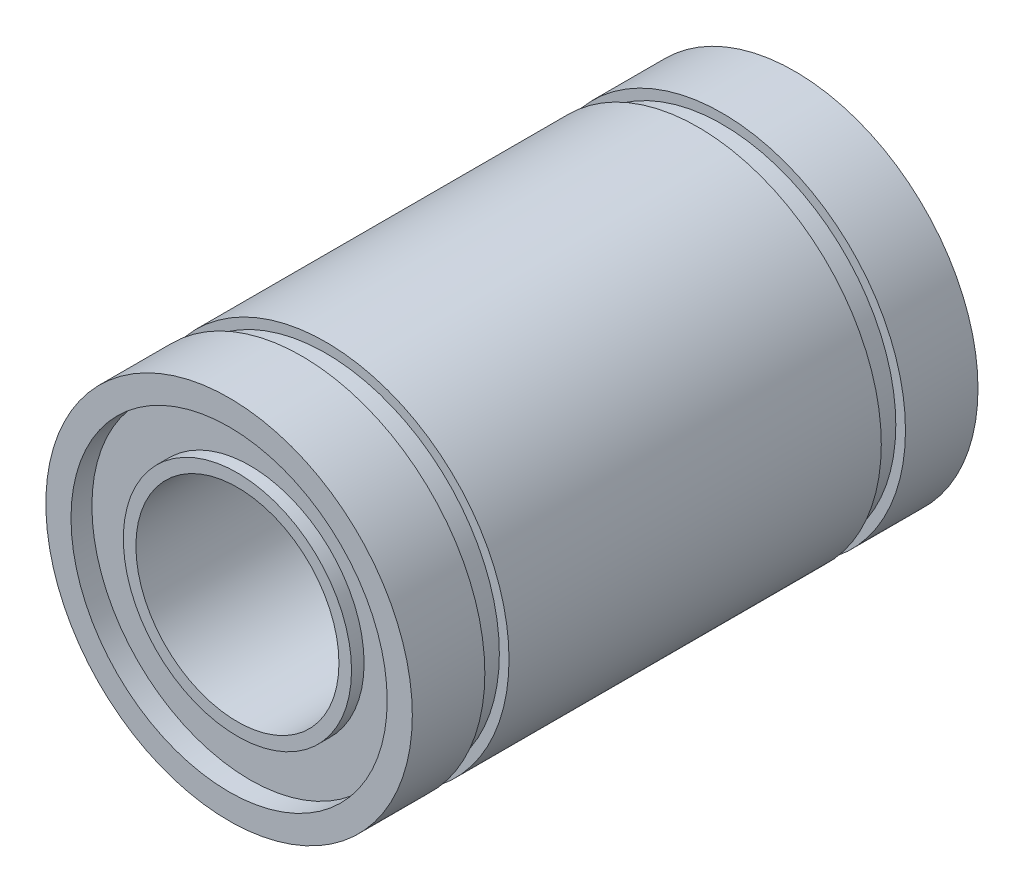
ISO-10303-21;
HEADER;
FILE_DESCRIPTION(('STEP AP214'),'2;1');
FILE_NAME('part.step','',(''),(''),'','','');
FILE_SCHEMA(('AUTOMOTIVE_DESIGN { 1 0 10303 214 1 1 1 1 }'));
ENDSEC;
DATA;
#1=APPLICATION_CONTEXT('core data for automotive mechanical design processes');
#2=APPLICATION_PROTOCOL_DEFINITION('international standard','automotive_design',2000,#1);
#3=PRODUCT_CONTEXT('',#1,'mechanical');
#4=PRODUCT('Part','Part','',(#3));
#5=PRODUCT_RELATED_PRODUCT_CATEGORY('part','',(#4));
#6=PRODUCT_DEFINITION_FORMATION('','',#4);
#7=PRODUCT_DEFINITION_CONTEXT('part definition',#1,'design');
#8=PRODUCT_DEFINITION('design','',#6,#7);
#9=PRODUCT_DEFINITION_SHAPE('','',#8);
#10=(LENGTH_UNIT() NAMED_UNIT(*) SI_UNIT(.MILLI.,.METRE.));
#11=(NAMED_UNIT(*) PLANE_ANGLE_UNIT() SI_UNIT($,.RADIAN.));
#12=(NAMED_UNIT(*) SI_UNIT($,.STERADIAN.) SOLID_ANGLE_UNIT());
#13=UNCERTAINTY_MEASURE_WITH_UNIT(LENGTH_MEASURE(1.E-05),#10,'distance_accuracy_value','');
#14=(GEOMETRIC_REPRESENTATION_CONTEXT(3) GLOBAL_UNCERTAINTY_ASSIGNED_CONTEXT((#13)) GLOBAL_UNIT_ASSIGNED_CONTEXT((#10,
#11,#12)) REPRESENTATION_CONTEXT('',''));
#15=CARTESIAN_POINT('',(0.,0.,0.));
#16=DIRECTION('',(0.,0.,1.));
#17=DIRECTION('',(1.,0.,0.));
#18=AXIS2_PLACEMENT_3D('',#15,#16,#17);
#19=CARTESIAN_POINT('',(8.175,0.,28.169061095084));
#20=DIRECTION('',(0.,0.,-1.));
#21=DIRECTION('',(1.,0.,0.));
#22=AXIS2_PLACEMENT_3D('',#19,#20,#21);
#23=PLANE('',#22);
#24=CARTESIAN_POINT('',(0.,0.,28.169061095084));
#25=DIRECTION('',(0.,0.,1.));
#26=DIRECTION('',(1.,0.,0.));
#27=AXIS2_PLACEMENT_3D('',#24,#25,#26);
#28=CIRCLE('',#27,8.175);
#29=CARTESIAN_POINT('',(8.175,0.,28.169061095084));
#30=VERTEX_POINT('',#29);
#31=EDGE_CURVE('E63',#30,#30,#28,.T.);
#32=ORIENTED_EDGE('',*,*,#31,.T.);
#33=EDGE_LOOP('',(#32));
#34=FACE_BOUND('',#33,.T.);
#35=CARTESIAN_POINT('',(0.,0.,28.169061095084));
#36=DIRECTION('',(0.,0.,-1.));
#37=DIRECTION('',(-1.,0.,0.));
#38=AXIS2_PLACEMENT_3D('',#35,#36,#37);
#39=CIRCLE('',#38,5.89999999999996);
#40=CARTESIAN_POINT('',(-5.89999999999996,0.,28.169061095084));
#41=VERTEX_POINT('',#40);
#42=EDGE_CURVE('E10',#41,#41,#39,.F.);
#43=ORIENTED_EDGE('',*,*,#42,.F.);
#44=EDGE_LOOP('',(#43));
#45=FACE_BOUND('',#44,.T.);
#46=ADVANCED_FACE('F41',(#34,#45),#23,.F.);
#47=CARTESIAN_POINT('',(8.175,0.,1.1));
#48=DIRECTION('',(0.,0.,1.));
#49=DIRECTION('',(1.,0.,0.));
#50=AXIS2_PLACEMENT_3D('',#47,#48,#49);
#51=PLANE('',#50);
#52=CARTESIAN_POINT('',(0.,0.,1.1));
#53=DIRECTION('',(0.,0.,1.));
#54=DIRECTION('',(1.,0.,0.));
#55=AXIS2_PLACEMENT_3D('',#52,#53,#54);
#56=CIRCLE('',#55,8.175);
#57=CARTESIAN_POINT('',(8.175,0.,1.1));
#58=VERTEX_POINT('',#57);
#59=EDGE_CURVE('E80',#58,#58,#56,.T.);
#60=ORIENTED_EDGE('',*,*,#59,.F.);
#61=EDGE_LOOP('',(#60));
#62=FACE_BOUND('',#61,.T.);
#63=CARTESIAN_POINT('',(0.,0.,1.1));
#64=DIRECTION('',(0.,0.,1.));
#65=DIRECTION('',(1.,0.,0.));
#66=AXIS2_PLACEMENT_3D('',#63,#64,#65);
#67=CIRCLE('',#66,5.89999999999996);
#68=CARTESIAN_POINT('',(5.89999999999996,0.,1.1));
#69=VERTEX_POINT('',#68);
#70=EDGE_CURVE('E48',#69,#69,#67,.F.);
#71=ORIENTED_EDGE('',*,*,#70,.F.);
#72=EDGE_LOOP('',(#71));
#73=FACE_BOUND('',#72,.T.);
#74=ADVANCED_FACE('F123',(#62,#73),#51,.F.);
#75=CARTESIAN_POINT('',(0.,0.,29.25));
#76=DIRECTION('',(0.,0.,-1.));
#77=DIRECTION('',(-1.,0.,0.));
#78=AXIS2_PLACEMENT_3D('',#75,#76,#77);
#79=CYLINDRICAL_SURFACE('',#78,9.475);
#80=CARTESIAN_POINT('',(0.,0.,3.75));
#81=DIRECTION('',(0.,0.,1.));
#82=DIRECTION('',(1.,0.,0.));
#83=AXIS2_PLACEMENT_3D('',#80,#81,#82);
#84=CIRCLE('',#83,9.475);
#85=CARTESIAN_POINT('',(9.475,0.,3.75));
#86=VERTEX_POINT('',#85);
#87=EDGE_CURVE('E70',#86,#86,#84,.T.);
#88=ORIENTED_EDGE('',*,*,#87,.F.);
#89=EDGE_LOOP('',(#88));
#90=FACE_BOUND('',#89,.T.);
#91=CARTESIAN_POINT('',(0.,0.,0.));
#92=DIRECTION('',(0.,0.,1.));
#93=DIRECTION('',(1.,0.,0.));
#94=AXIS2_PLACEMENT_3D('',#91,#92,#93);
#95=CIRCLE('',#94,9.475);
#96=CARTESIAN_POINT('',(9.475,0.,0.));
#97=VERTEX_POINT('',#96);
#98=EDGE_CURVE('E56',#97,#97,#95,.T.);
#99=ORIENTED_EDGE('',*,*,#98,.T.);
#100=EDGE_LOOP('',(#99));
#101=FACE_BOUND('',#100,.T.);
#102=ADVANCED_FACE('F43',(#90,#101),#79,.T.);
#103=CARTESIAN_POINT('',(0.,0.,0.));
#104=DIRECTION('',(0.,0.,1.));
#105=DIRECTION('',(1.,0.,0.));
#106=AXIS2_PLACEMENT_3D('',#103,#104,#105);
#107=PLANE('',#106);
#108=CARTESIAN_POINT('',(0.,0.,0.));
#109=DIRECTION('',(0.,0.,1.));
#110=DIRECTION('',(1.,0.,0.));
#111=AXIS2_PLACEMENT_3D('',#108,#109,#110);
#112=CIRCLE('',#111,8.175);
#113=CARTESIAN_POINT('',(8.175,0.,0.));
#114=VERTEX_POINT('',#113);
#115=EDGE_CURVE('E62',#114,#114,#112,.T.);
#116=ORIENTED_EDGE('',*,*,#115,.T.);
#117=EDGE_LOOP('',(#116));
#118=FACE_BOUND('',#117,.T.);
#119=ORIENTED_EDGE('',*,*,#98,.F.);
#120=EDGE_LOOP('',(#119));
#121=FACE_BOUND('',#120,.T.);
#122=ADVANCED_FACE('F153',(#118,#121),#107,.F.);
#123=CARTESIAN_POINT('',(9.475,0.,5.));
#124=DIRECTION('',(0.,0.,1.));
#125=DIRECTION('',(1.,0.,0.));
#126=AXIS2_PLACEMENT_3D('',#123,#124,#125);
#127=PLANE('',#126);
#128=CARTESIAN_POINT('',(0.,0.,5.));
#129=DIRECTION('',(0.,0.,1.));
#130=DIRECTION('',(1.,0.,0.));
#131=AXIS2_PLACEMENT_3D('',#128,#129,#130);
#132=CIRCLE('',#131,9.475);
#133=CARTESIAN_POINT('',(9.475,0.,5.));
#134=VERTEX_POINT('',#133);
#135=EDGE_CURVE('E65',#134,#134,#132,.T.);
#136=ORIENTED_EDGE('',*,*,#135,.F.);
#137=EDGE_LOOP('',(#136));
#138=FACE_BOUND('',#137,.T.);
#139=CARTESIAN_POINT('',(0.,0.,5.));
#140=DIRECTION('',(0.,0.,1.));
#141=DIRECTION('',(1.,0.,0.));
#142=AXIS2_PLACEMENT_3D('',#139,#140,#141);
#143=CIRCLE('',#142,8.975);
#144=CARTESIAN_POINT('',(8.975,0.,5.));
#145=VERTEX_POINT('',#144);
#146=EDGE_CURVE('E83',#145,#145,#143,.T.);
#147=ORIENTED_EDGE('',*,*,#146,.T.);
#148=EDGE_LOOP('',(#147));
#149=FACE_BOUND('',#148,.T.);
#150=ADVANCED_FACE('F149',(#138,#149),#127,.F.);
#151=CARTESIAN_POINT('',(0.,0.,29.25));
#152=DIRECTION('',(0.,0.,1.));
#153=DIRECTION('',(1.,0.,0.));
#154=AXIS2_PLACEMENT_3D('',#151,#152,#153);
#155=CYLINDRICAL_SURFACE('',#154,8.975);
#156=ORIENTED_EDGE('',*,*,#146,.F.);
#157=EDGE_LOOP('',(#156));
#158=FACE_BOUND('',#157,.T.);
#159=CARTESIAN_POINT('',(0.,0.,3.75));
#160=DIRECTION('',(0.,0.,1.));
#161=DIRECTION('',(1.,0.,0.));
#162=AXIS2_PLACEMENT_3D('',#159,#160,#161);
#163=CIRCLE('',#162,8.975);
#164=CARTESIAN_POINT('',(8.975,0.,3.75));
#165=VERTEX_POINT('',#164);
#166=EDGE_CURVE('E86',#165,#165,#163,.T.);
#167=ORIENTED_EDGE('',*,*,#166,.T.);
#168=EDGE_LOOP('',(#167));
#169=FACE_BOUND('',#168,.T.);
#170=ADVANCED_FACE('F145',(#158,#169),#155,.T.);
#171=CARTESIAN_POINT('',(9.475,0.,3.75));
#172=DIRECTION('',(0.,0.,-1.));
#173=DIRECTION('',(-1.,0.,0.));
#174=AXIS2_PLACEMENT_3D('',#171,#172,#173);
#175=PLANE('',#174);
#176=ORIENTED_EDGE('',*,*,#166,.F.);
#177=EDGE_LOOP('',(#176));
#178=FACE_BOUND('',#177,.T.);
#179=ORIENTED_EDGE('',*,*,#87,.T.);
#180=EDGE_LOOP('',(#179));
#181=FACE_BOUND('',#180,.T.);
#182=ADVANCED_FACE('F141',(#178,#181),#175,.F.);
#183=ORIENTED_EDGE('',*,*,#135,.T.);
#184=EDGE_LOOP('',(#183));
#185=FACE_BOUND('',#184,.T.);
#186=CARTESIAN_POINT('',(0.,0.,24.25));
#187=DIRECTION('',(0.,0.,1.));
#188=DIRECTION('',(1.,0.,0.));
#189=AXIS2_PLACEMENT_3D('',#186,#187,#188);
#190=CIRCLE('',#189,9.475);
#191=CARTESIAN_POINT('',(9.475,0.,24.25));
#192=VERTEX_POINT('',#191);
#193=EDGE_CURVE('E77',#192,#192,#190,.T.);
#194=ORIENTED_EDGE('',*,*,#193,.F.);
#195=EDGE_LOOP('',(#194));
#196=FACE_BOUND('',#195,.T.);
#197=ADVANCED_FACE('F144',(#185,#196),#79,.T.);
#198=CARTESIAN_POINT('',(9.475,0.,25.5));
#199=DIRECTION('',(0.,0.,1.));
#200=DIRECTION('',(1.,0.,0.));
#201=AXIS2_PLACEMENT_3D('',#198,#199,#200);
#202=PLANE('',#201);
#203=CARTESIAN_POINT('',(0.,0.,25.5));
#204=DIRECTION('',(0.,0.,1.));
#205=DIRECTION('',(1.,0.,0.));
#206=AXIS2_PLACEMENT_3D('',#203,#204,#205);
#207=CIRCLE('',#206,9.475);
#208=CARTESIAN_POINT('',(9.475,0.,25.5));
#209=VERTEX_POINT('',#208);
#210=EDGE_CURVE('E67',#209,#209,#207,.T.);
#211=ORIENTED_EDGE('',*,*,#210,.F.);
#212=EDGE_LOOP('',(#211));
#213=FACE_BOUND('',#212,.T.);
#214=CARTESIAN_POINT('',(0.,0.,25.5));
#215=DIRECTION('',(0.,0.,1.));
#216=DIRECTION('',(1.,0.,0.));
#217=AXIS2_PLACEMENT_3D('',#214,#215,#216);
#218=CIRCLE('',#217,8.975);
#219=CARTESIAN_POINT('',(8.975,0.,25.5));
#220=VERTEX_POINT('',#219);
#221=EDGE_CURVE('E71',#220,#220,#218,.T.);
#222=ORIENTED_EDGE('',*,*,#221,.T.);
#223=EDGE_LOOP('',(#222));
#224=FACE_BOUND('',#223,.T.);
#225=ADVANCED_FACE('F163',(#213,#224),#202,.F.);
#226=CARTESIAN_POINT('',(0.,0.,29.25));
#227=DIRECTION('',(0.,0.,1.));
#228=DIRECTION('',(1.,0.,0.));
#229=AXIS2_PLACEMENT_3D('',#226,#227,#228);
#230=CYLINDRICAL_SURFACE('',#229,8.975);
#231=ORIENTED_EDGE('',*,*,#221,.F.);
#232=EDGE_LOOP('',(#231));
#233=FACE_BOUND('',#232,.T.);
#234=CARTESIAN_POINT('',(0.,0.,24.25));
#235=DIRECTION('',(0.,0.,1.));
#236=DIRECTION('',(1.,0.,0.));
#237=AXIS2_PLACEMENT_3D('',#234,#235,#236);
#238=CIRCLE('',#237,8.975);
#239=CARTESIAN_POINT('',(8.975,0.,24.25));
#240=VERTEX_POINT('',#239);
#241=EDGE_CURVE('E74',#240,#240,#238,.T.);
#242=ORIENTED_EDGE('',*,*,#241,.T.);
#243=EDGE_LOOP('',(#242));
#244=FACE_BOUND('',#243,.T.);
#245=ADVANCED_FACE('F159',(#233,#244),#230,.T.);
#246=CARTESIAN_POINT('',(9.475,0.,24.25));
#247=DIRECTION('',(0.,0.,-1.));
#248=DIRECTION('',(-1.,0.,0.));
#249=AXIS2_PLACEMENT_3D('',#246,#247,#248);
#250=PLANE('',#249);
#251=ORIENTED_EDGE('',*,*,#241,.F.);
#252=EDGE_LOOP('',(#251));
#253=FACE_BOUND('',#252,.T.);
#254=ORIENTED_EDGE('',*,*,#193,.T.);
#255=EDGE_LOOP('',(#254));
#256=FACE_BOUND('',#255,.T.);
#257=ADVANCED_FACE('F155',(#253,#256),#250,.F.);
#258=CARTESIAN_POINT('',(0.,0.,29.25));
#259=DIRECTION('',(0.,0.,1.));
#260=DIRECTION('',(1.,0.,0.));
#261=AXIS2_PLACEMENT_3D('',#258,#259,#260);
#262=PLANE('',#261);
#263=CARTESIAN_POINT('',(0.,0.,29.25));
#264=DIRECTION('',(0.,0.,1.));
#265=DIRECTION('',(1.,0.,0.));
#266=AXIS2_PLACEMENT_3D('',#263,#264,#265);
#267=CIRCLE('',#266,8.175);
#268=CARTESIAN_POINT('',(8.175,0.,29.25));
#269=VERTEX_POINT('',#268);
#270=EDGE_CURVE('E59',#269,#269,#267,.T.);
#271=ORIENTED_EDGE('',*,*,#270,.F.);
#272=EDGE_LOOP('',(#271));
#273=FACE_BOUND('',#272,.T.);
#274=CARTESIAN_POINT('',(0.,0.,29.25));
#275=DIRECTION('',(0.,0.,1.));
#276=DIRECTION('',(1.,0.,0.));
#277=AXIS2_PLACEMENT_3D('',#274,#275,#276);
#278=CIRCLE('',#277,9.475);
#279=CARTESIAN_POINT('',(9.475,0.,29.25));
#280=VERTEX_POINT('',#279);
#281=EDGE_CURVE('E52',#280,#280,#278,.T.);
#282=ORIENTED_EDGE('',*,*,#281,.T.);
#283=EDGE_LOOP('',(#282));
#284=FACE_BOUND('',#283,.T.);
#285=ADVANCED_FACE('F158',(#273,#284),#262,.T.);
#286=ORIENTED_EDGE('',*,*,#210,.T.);
#287=EDGE_LOOP('',(#286));
#288=FACE_BOUND('',#287,.T.);
#289=ORIENTED_EDGE('',*,*,#281,.F.);
#290=EDGE_LOOP('',(#289));
#291=FACE_BOUND('',#290,.T.);
#292=ADVANCED_FACE('F138',(#288,#291),#79,.T.);
#293=CARTESIAN_POINT('',(0.,0.,29.25));
#294=DIRECTION('',(0.,0.,1.));
#295=DIRECTION('',(1.,0.,0.));
#296=AXIS2_PLACEMENT_3D('',#293,#294,#295);
#297=CYLINDRICAL_SURFACE('',#296,8.175);
#298=ORIENTED_EDGE('',*,*,#115,.F.);
#299=EDGE_LOOP('',(#298));
#300=FACE_BOUND('',#299,.T.);
#301=ORIENTED_EDGE('',*,*,#59,.T.);
#302=EDGE_LOOP('',(#301));
#303=FACE_BOUND('',#302,.T.);
#304=ADVANCED_FACE('F136',(#300,#303),#297,.F.);
#305=CARTESIAN_POINT('',(0.,0.,0.0190610950839831));
#306=DIRECTION('',(0.,0.,-1.));
#307=DIRECTION('',(1.,0.,0.));
#308=AXIS2_PLACEMENT_3D('',#305,#306,#307);
#309=CYLINDRICAL_SURFACE('',#308,8.175);
#310=ORIENTED_EDGE('',*,*,#270,.T.);
#311=EDGE_LOOP('',(#310));
#312=FACE_BOUND('',#311,.T.);
#313=ORIENTED_EDGE('',*,*,#31,.F.);
#314=EDGE_LOOP('',(#313));
#315=FACE_BOUND('',#314,.T.);
#316=ADVANCED_FACE('F134',(#312,#315),#309,.F.);
#317=CARTESIAN_POINT('',(0.,0.,1.1));
#318=DIRECTION('',(0.,0.,-1.));
#319=DIRECTION('',(-1.,0.,0.));
#320=AXIS2_PLACEMENT_3D('',#317,#318,#319);
#321=CYLINDRICAL_SURFACE('',#320,5.24999999999999);
#322=CARTESIAN_POINT('',(0.,0.,0.449999999999999));
#323=DIRECTION('',(0.,0.,1.));
#324=DIRECTION('',(1.,0.,0.));
#325=AXIS2_PLACEMENT_3D('',#322,#323,#324);
#326=CIRCLE('',#325,5.24999999999996);
#327=CARTESIAN_POINT('',(5.24999999999996,0.,0.449999999999999));
#328=VERTEX_POINT('',#327);
#329=EDGE_CURVE('E100',#328,#328,#326,.T.);
#330=ORIENTED_EDGE('',*,*,#329,.F.);
#331=EDGE_LOOP('',(#330));
#332=FACE_BOUND('',#331,.T.);
#333=CARTESIAN_POINT('',(0.,0.,28.819061095084));
#334=DIRECTION('',(0.,0.,1.));
#335=DIRECTION('',(1.,0.,0.));
#336=AXIS2_PLACEMENT_3D('',#333,#334,#335);
#337=CIRCLE('',#336,5.24999999999996);
#338=CARTESIAN_POINT('',(5.24999999999996,0.,28.819061095084));
#339=VERTEX_POINT('',#338);
#340=EDGE_CURVE('E106',#339,#339,#337,.T.);
#341=ORIENTED_EDGE('',*,*,#340,.T.);
#342=EDGE_LOOP('',(#341));
#343=FACE_BOUND('',#342,.T.);
#344=ADVANCED_FACE('F110',(#332,#343),#321,.F.);
#345=CARTESIAN_POINT('',(0.,0.,29.269061095084));
#346=DIRECTION('',(0.,0.,1.));
#347=DIRECTION('',(1.,0.,0.));
#348=AXIS2_PLACEMENT_3D('',#345,#346,#347);
#349=CYLINDRICAL_SURFACE('',#348,5.89999999999996);
#350=ORIENTED_EDGE('',*,*,#70,.T.);
#351=EDGE_LOOP('',(#350));
#352=FACE_BOUND('',#351,.T.);
#353=CARTESIAN_POINT('',(0.,0.,0.449999999999999));
#354=DIRECTION('',(0.,0.,1.));
#355=DIRECTION('',(1.,0.,0.));
#356=AXIS2_PLACEMENT_3D('',#353,#354,#355);
#357=CIRCLE('',#356,5.89999999999996);
#358=CARTESIAN_POINT('',(5.89999999999996,0.,0.449999999999999));
#359=VERTEX_POINT('',#358);
#360=EDGE_CURVE('E97',#359,#359,#357,.T.);
#361=ORIENTED_EDGE('',*,*,#360,.T.);
#362=EDGE_LOOP('',(#361));
#363=FACE_BOUND('',#362,.T.);
#364=ADVANCED_FACE('F221',(#352,#363),#349,.T.);
#365=CARTESIAN_POINT('',(0.,5.24999999999996,0.449999999999999));
#366=DIRECTION('',(0.,0.,1.));
#367=DIRECTION('',(1.,0.,0.));
#368=AXIS2_PLACEMENT_3D('',#365,#366,#367);
#369=PLANE('',#368);
#370=ORIENTED_EDGE('',*,*,#360,.F.);
#371=EDGE_LOOP('',(#370));
#372=FACE_BOUND('',#371,.T.);
#373=ORIENTED_EDGE('',*,*,#329,.T.);
#374=EDGE_LOOP('',(#373));
#375=FACE_BOUND('',#374,.T.);
#376=ADVANCED_FACE('F120',(#372,#375),#369,.F.);
#377=CARTESIAN_POINT('',(0.,0.,0.));
#378=DIRECTION('',(0.,0.,-1.));
#379=DIRECTION('',(1.,0.,0.));
#380=AXIS2_PLACEMENT_3D('',#377,#378,#379);
#381=CYLINDRICAL_SURFACE('',#380,5.89999999999996);
#382=ORIENTED_EDGE('',*,*,#42,.T.);
#383=EDGE_LOOP('',(#382));
#384=FACE_BOUND('',#383,.T.);
#385=CARTESIAN_POINT('',(0.,0.,28.819061095084));
#386=DIRECTION('',(0.,0.,1.));
#387=DIRECTION('',(1.,0.,0.));
#388=AXIS2_PLACEMENT_3D('',#385,#386,#387);
#389=CIRCLE('',#388,5.89999999999996);
#390=CARTESIAN_POINT('',(5.89999999999996,0.,28.819061095084));
#391=VERTEX_POINT('',#390);
#392=EDGE_CURVE('E103',#391,#391,#389,.T.);
#393=ORIENTED_EDGE('',*,*,#392,.F.);
#394=EDGE_LOOP('',(#393));
#395=FACE_BOUND('',#394,.T.);
#396=ADVANCED_FACE('F114',(#384,#395),#381,.T.);
#397=CARTESIAN_POINT('',(0.,5.24999999999996,28.819061095084));
#398=DIRECTION('',(0.,0.,-1.));
#399=DIRECTION('',(1.,0.,0.));
#400=AXIS2_PLACEMENT_3D('',#397,#398,#399);
#401=PLANE('',#400);
#402=ORIENTED_EDGE('',*,*,#392,.T.);
#403=EDGE_LOOP('',(#402));
#404=FACE_BOUND('',#403,.T.);
#405=ORIENTED_EDGE('',*,*,#340,.F.);
#406=EDGE_LOOP('',(#405));
#407=FACE_BOUND('',#406,.T.);
#408=ADVANCED_FACE('F112',(#404,#407),#401,.F.);
#409=CLOSED_SHELL('',(#46,#74,#102,#122,#150,#170,#182,#197,#225,#245,#257,#285,#292,#304,#316,
#344,#364,#376,#396,#408));
#410=MANIFOLD_SOLID_BREP('B2',#409);
#411=ADVANCED_BREP_SHAPE_REPRESENTATION('',(#18,#410),#14);
#412=SHAPE_DEFINITION_REPRESENTATION(#9,#411);
ENDSEC;
END-ISO-10303-21;
